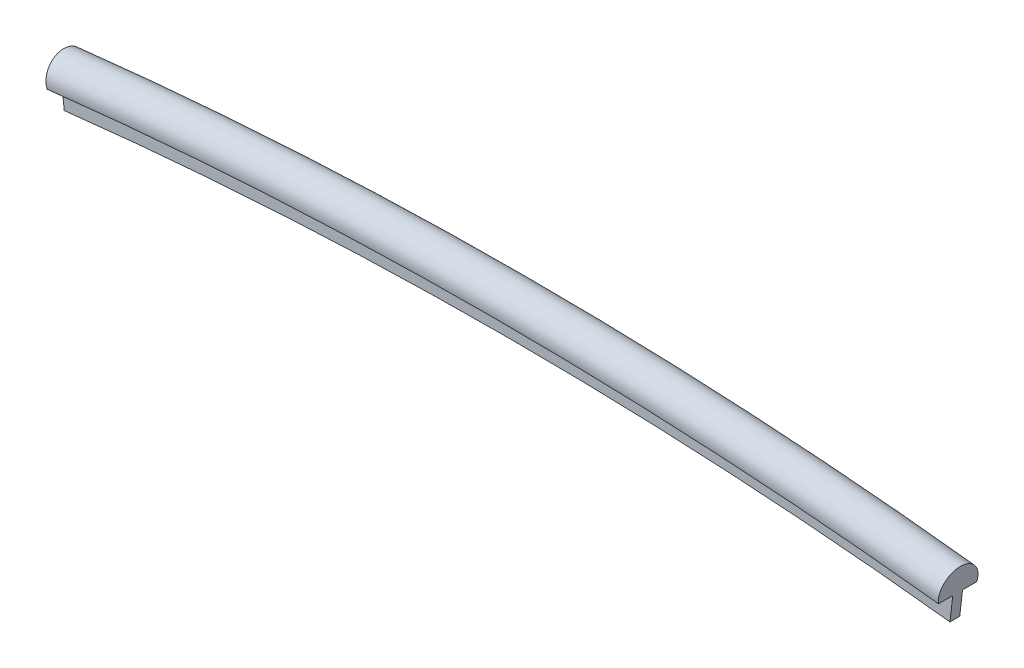
ISO-10303-21;
HEADER;
FILE_DESCRIPTION(('STEP AP214'),'2;1');
FILE_NAME('part.step','',(''),(''),'','','');
FILE_SCHEMA(('AUTOMOTIVE_DESIGN { 1 0 10303 214 1 1 1 1 }'));
ENDSEC;
DATA;
#1=APPLICATION_CONTEXT('core data for automotive mechanical design processes');
#2=APPLICATION_PROTOCOL_DEFINITION('international standard','automotive_design',2000,#1);
#3=PRODUCT_CONTEXT('',#1,'mechanical');
#4=PRODUCT('Part','Part','',(#3));
#5=PRODUCT_RELATED_PRODUCT_CATEGORY('part','',(#4));
#6=PRODUCT_DEFINITION_FORMATION('','',#4);
#7=PRODUCT_DEFINITION_CONTEXT('part definition',#1,'design');
#8=PRODUCT_DEFINITION('design','',#6,#7);
#9=PRODUCT_DEFINITION_SHAPE('','',#8);
#10=(LENGTH_UNIT() NAMED_UNIT(*) SI_UNIT(.MILLI.,.METRE.));
#11=(NAMED_UNIT(*) PLANE_ANGLE_UNIT() SI_UNIT($,.RADIAN.));
#12=(NAMED_UNIT(*) SI_UNIT($,.STERADIAN.) SOLID_ANGLE_UNIT());
#13=UNCERTAINTY_MEASURE_WITH_UNIT(LENGTH_MEASURE(1.E-05),#10,'distance_accuracy_value','');
#14=(GEOMETRIC_REPRESENTATION_CONTEXT(3) GLOBAL_UNCERTAINTY_ASSIGNED_CONTEXT((#13)) GLOBAL_UNIT_ASSIGNED_CONTEXT((#10,
#11,#12)) REPRESENTATION_CONTEXT('',''));
#15=CARTESIAN_POINT('',(0.,0.,0.));
#16=DIRECTION('',(0.,0.,1.));
#17=DIRECTION('',(1.,0.,0.));
#18=AXIS2_PLACEMENT_3D('',#15,#16,#17);
#19=CARTESIAN_POINT('',(0.,0.,70.5976415970385));
#20=DIRECTION('',(0.,0.,1.));
#21=DIRECTION('',(1.,0.,0.));
#22=AXIS2_PLACEMENT_3D('',#19,#20,#21);
#23=CYLINDRICAL_SURFACE('',#22,241.3);
#24=CARTESIAN_POINT('',(0.,0.,1.18));
#25=DIRECTION('',(0.,0.,1.));
#26=DIRECTION('',(1.,0.,0.));
#27=AXIS2_PLACEMENT_3D('',#24,#25,#26);
#28=CIRCLE('',#27,241.3);
#29=CARTESIAN_POINT('',(27.4256294724037,239.736365301642,1.18));
#30=VERTEX_POINT('',#29);
#31=CARTESIAN_POINT('',(-27.4256294724037,239.736365301642,1.18));
#32=VERTEX_POINT('',#31);
#33=EDGE_CURVE('E11',#30,#32,#28,.T.);
#34=ORIENTED_EDGE('',*,*,#33,.T.);
#35=DIRECTION('',(0.,0.,-1.));
#36=VECTOR('',#35,1.);
#37=CARTESIAN_POINT('',(-27.4256294724037,239.736365301642,1.18));
#38=LINE('',#37,#36);
#39=CARTESIAN_POINT('',(-27.4256294724037,239.736365301642,0.3));
#40=VERTEX_POINT('',#39);
#41=EDGE_CURVE('E103',#32,#40,#38,.T.);
#42=ORIENTED_EDGE('',*,*,#41,.T.);
#43=CARTESIAN_POINT('',(0.,0.,0.299999999999995));
#44=DIRECTION('',(0.,0.,1.));
#45=DIRECTION('',(1.,0.,0.));
#46=AXIS2_PLACEMENT_3D('',#43,#44,#45);
#47=CIRCLE('',#46,241.3);
#48=CARTESIAN_POINT('',(27.4256294724037,239.736365301642,0.3));
#49=VERTEX_POINT('',#48);
#50=EDGE_CURVE('E85',#49,#40,#47,.T.);
#51=ORIENTED_EDGE('',*,*,#50,.F.);
#52=DIRECTION('',(0.,0.,-1.));
#53=VECTOR('',#52,1.);
#54=CARTESIAN_POINT('',(27.4256294724037,239.736365301642,1.18));
#55=LINE('',#54,#53);
#56=EDGE_CURVE('E117',#30,#49,#55,.T.);
#57=ORIENTED_EDGE('',*,*,#56,.F.);
#58=EDGE_LOOP('',(#34,#42,#51,#57));
#59=FACE_BOUND('',#58,.T.);
#60=ADVANCED_FACE('F33',(#59),#23,.F.);
#61=CARTESIAN_POINT('',(0.,0.,0.));
#62=DIRECTION('',(0.,0.,1.));
#63=DIRECTION('',(1.,0.,0.));
#64=AXIS2_PLACEMENT_3D('',#61,#62,#63);
#65=TOROIDAL_SURFACE('',#64,241.586013989906,1.21416802890791);
#66=CARTESIAN_POINT('',(0.,0.,-1.18));
#67=DIRECTION('',(0.,0.,1.));
#68=DIRECTION('',(1.,0.,0.));
#69=AXIS2_PLACEMENT_3D('',#66,#67,#68);
#70=CIRCLE('',#69,241.3);
#71=CARTESIAN_POINT('',(27.4256294724037,239.736365301642,-1.18));
#72=VERTEX_POINT('',#71);
#73=CARTESIAN_POINT('',(-27.4256294724037,239.736365301642,-1.18));
#74=VERTEX_POINT('',#73);
#75=EDGE_CURVE('E41',#72,#74,#70,.T.);
#76=ORIENTED_EDGE('',*,*,#75,.T.);
#77=CARTESIAN_POINT('',(-27.4581371960303,240.020525908213,0.));
#78=DIRECTION('',(0.993519955663664,0.113657809665991,0.));
#79=DIRECTION('',(0.,0.,1.));
#80=AXIS2_PLACEMENT_3D('',#77,#78,#79);
#81=CIRCLE('',#80,1.21416802890791);
#82=EDGE_CURVE('E115',#74,#32,#81,.T.);
#83=ORIENTED_EDGE('',*,*,#82,.T.);
#84=ORIENTED_EDGE('',*,*,#33,.F.);
#85=CARTESIAN_POINT('',(27.4581371960303,240.020525908213,0.));
#86=DIRECTION('',(0.993519955663664,-0.113657809665991,0.));
#87=DIRECTION('',(0.,0.,1.));
#88=AXIS2_PLACEMENT_3D('',#85,#86,#87);
#89=CIRCLE('',#88,1.21416802890791);
#90=EDGE_CURVE('E97',#72,#30,#89,.T.);
#91=ORIENTED_EDGE('',*,*,#90,.F.);
#92=EDGE_LOOP('',(#76,#83,#84,#91));
#93=FACE_BOUND('',#92,.T.);
#94=ADVANCED_FACE('F35',(#93),#65,.T.);
#95=CARTESIAN_POINT('',(0.,0.,70.5976415970385));
#96=DIRECTION('',(0.,0.,1.));
#97=DIRECTION('',(1.,0.,0.));
#98=AXIS2_PLACEMENT_3D('',#95,#96,#97);
#99=CYLINDRICAL_SURFACE('',#98,241.3);
#100=CARTESIAN_POINT('',(0.,0.,-0.299999999999995));
#101=DIRECTION('',(0.,0.,1.));
#102=DIRECTION('',(1.,0.,0.));
#103=AXIS2_PLACEMENT_3D('',#100,#101,#102);
#104=CIRCLE('',#103,241.3);
#105=CARTESIAN_POINT('',(27.4256294724037,239.736365301642,-0.3));
#106=VERTEX_POINT('',#105);
#107=CARTESIAN_POINT('',(-27.4256294724037,239.736365301642,-0.3));
#108=VERTEX_POINT('',#107);
#109=EDGE_CURVE('E132',#106,#108,#104,.T.);
#110=ORIENTED_EDGE('',*,*,#109,.T.);
#111=DIRECTION('',(0.,0.,-1.));
#112=VECTOR('',#111,1.);
#113=CARTESIAN_POINT('',(-27.4256294724037,239.736365301642,-0.3));
#114=LINE('',#113,#112);
#115=EDGE_CURVE('E113',#108,#74,#114,.T.);
#116=ORIENTED_EDGE('',*,*,#115,.T.);
#117=ORIENTED_EDGE('',*,*,#75,.F.);
#118=DIRECTION('',(0.,0.,-1.));
#119=VECTOR('',#118,1.);
#120=CARTESIAN_POINT('',(27.4256294724037,239.736365301642,-0.3));
#121=LINE('',#120,#119);
#122=EDGE_CURVE('E125',#106,#72,#121,.T.);
#123=ORIENTED_EDGE('',*,*,#122,.F.);
#124=EDGE_LOOP('',(#110,#116,#117,#123));
#125=FACE_BOUND('',#124,.T.);
#126=ADVANCED_FACE('F134',(#125),#99,.F.);
#127=CARTESIAN_POINT('',(27.2551427579047,238.246085368147,-0.3));
#128=DIRECTION('',(0.,0.,1.));
#129=DIRECTION('',(1.,0.,0.));
#130=AXIS2_PLACEMENT_3D('',#127,#128,#129);
#131=PLANE('',#130);
#132=CARTESIAN_POINT('',(0.,0.,-0.299999999999995));
#133=DIRECTION('',(0.,0.,1.));
#134=DIRECTION('',(1.,0.,0.));
#135=AXIS2_PLACEMENT_3D('',#132,#133,#134);
#136=CIRCLE('',#135,239.8);
#137=CARTESIAN_POINT('',(27.2551427579047,238.246085368147,-0.3));
#138=VERTEX_POINT('',#137);
#139=CARTESIAN_POINT('',(-27.2551427579047,238.246085368147,-0.3));
#140=VERTEX_POINT('',#139);
#141=EDGE_CURVE('E129',#138,#140,#136,.T.);
#142=ORIENTED_EDGE('',*,*,#141,.T.);
#143=DIRECTION('',(-0.113657809665991,0.993519955663664,0.));
#144=VECTOR('',#143,1.);
#145=CARTESIAN_POINT('',(-27.2551427579047,238.246085368147,-0.3));
#146=LINE('',#145,#144);
#147=EDGE_CURVE('E110',#140,#108,#146,.T.);
#148=ORIENTED_EDGE('',*,*,#147,.T.);
#149=ORIENTED_EDGE('',*,*,#109,.F.);
#150=DIRECTION('',(0.113657809665991,0.993519955663664,0.));
#151=VECTOR('',#150,1.);
#152=CARTESIAN_POINT('',(27.2551427579047,238.246085368147,-0.3));
#153=LINE('',#152,#151);
#154=EDGE_CURVE('E122',#138,#106,#153,.T.);
#155=ORIENTED_EDGE('',*,*,#154,.F.);
#156=EDGE_LOOP('',(#142,#148,#149,#155));
#157=FACE_BOUND('',#156,.T.);
#158=ADVANCED_FACE('F136',(#157),#131,.F.);
#159=CARTESIAN_POINT('',(0.,0.,70.5976415970385));
#160=DIRECTION('',(0.,0.,1.));
#161=DIRECTION('',(1.,0.,0.));
#162=AXIS2_PLACEMENT_3D('',#159,#160,#161);
#163=CYLINDRICAL_SURFACE('',#162,239.8);
#164=CARTESIAN_POINT('',(0.,0.,0.299999999999995));
#165=DIRECTION('',(0.,0.,1.));
#166=DIRECTION('',(1.,0.,0.));
#167=AXIS2_PLACEMENT_3D('',#164,#165,#166);
#168=CIRCLE('',#167,239.8);
#169=CARTESIAN_POINT('',(27.2551427579047,238.246085368147,0.3));
#170=VERTEX_POINT('',#169);
#171=CARTESIAN_POINT('',(-27.2551427579047,238.246085368147,0.3));
#172=VERTEX_POINT('',#171);
#173=EDGE_CURVE('E96',#170,#172,#168,.T.);
#174=ORIENTED_EDGE('',*,*,#173,.T.);
#175=DIRECTION('',(0.,0.,-1.));
#176=VECTOR('',#175,1.);
#177=CARTESIAN_POINT('',(-27.2551427579047,238.246085368147,0.));
#178=LINE('',#177,#176);
#179=EDGE_CURVE('E105',#172,#140,#178,.T.);
#180=ORIENTED_EDGE('',*,*,#179,.T.);
#181=ORIENTED_EDGE('',*,*,#141,.F.);
#182=DIRECTION('',(0.,0.,-1.));
#183=VECTOR('',#182,1.);
#184=CARTESIAN_POINT('',(27.2551427579047,238.246085368147,0.));
#185=LINE('',#184,#183);
#186=EDGE_CURVE('E120',#170,#138,#185,.T.);
#187=ORIENTED_EDGE('',*,*,#186,.F.);
#188=EDGE_LOOP('',(#174,#180,#181,#187));
#189=FACE_BOUND('',#188,.T.);
#190=ADVANCED_FACE('F141',(#189),#163,.F.);
#191=CARTESIAN_POINT('',(27.2551427579047,238.246085368147,0.3));
#192=DIRECTION('',(0.,0.,-1.));
#193=DIRECTION('',(-1.,0.,0.));
#194=AXIS2_PLACEMENT_3D('',#191,#192,#193);
#195=PLANE('',#194);
#196=DIRECTION('',(-0.113657809665991,-0.993519955663664,0.));
#197=VECTOR('',#196,1.);
#198=CARTESIAN_POINT('',(27.2551427579047,238.246085368147,0.3));
#199=LINE('',#198,#197);
#200=EDGE_CURVE('E91',#49,#170,#199,.T.);
#201=ORIENTED_EDGE('',*,*,#200,.F.);
#202=ORIENTED_EDGE('',*,*,#50,.T.);
#203=DIRECTION('',(0.113657809665991,-0.993519955663664,0.));
#204=VECTOR('',#203,1.);
#205=CARTESIAN_POINT('',(-27.2551427579047,238.246085368147,0.3));
#206=LINE('',#205,#204);
#207=EDGE_CURVE('E88',#40,#172,#206,.T.);
#208=ORIENTED_EDGE('',*,*,#207,.T.);
#209=ORIENTED_EDGE('',*,*,#173,.F.);
#210=EDGE_LOOP('',(#201,#202,#208,#209));
#211=FACE_BOUND('',#210,.T.);
#212=ADVANCED_FACE('F87',(#211),#195,.F.);
#213=CARTESIAN_POINT('',(27.4581371960303,240.020525908213,0.));
#214=DIRECTION('',(-0.993519955663664,0.113657809665991,0.));
#215=DIRECTION('',(0.,0.,1.));
#216=AXIS2_PLACEMENT_3D('',#213,#214,#215);
#217=PLANE('',#216);
#218=ORIENTED_EDGE('',*,*,#56,.T.);
#219=ORIENTED_EDGE('',*,*,#200,.T.);
#220=ORIENTED_EDGE('',*,*,#186,.T.);
#221=ORIENTED_EDGE('',*,*,#154,.T.);
#222=ORIENTED_EDGE('',*,*,#122,.T.);
#223=ORIENTED_EDGE('',*,*,#90,.T.);
#224=EDGE_LOOP('',(#218,#219,#220,#221,#222,#223));
#225=FACE_BOUND('',#224,.T.);
#226=ADVANCED_FACE('F143',(#225),#217,.F.);
#227=CARTESIAN_POINT('',(-27.4581371960303,240.020525908213,0.));
#228=DIRECTION('',(-0.993519955663664,-0.113657809665991,0.));
#229=DIRECTION('',(0.,0.,1.));
#230=AXIS2_PLACEMENT_3D('',#227,#228,#229);
#231=PLANE('',#230);
#232=ORIENTED_EDGE('',*,*,#41,.F.);
#233=ORIENTED_EDGE('',*,*,#82,.F.);
#234=ORIENTED_EDGE('',*,*,#115,.F.);
#235=ORIENTED_EDGE('',*,*,#147,.F.);
#236=ORIENTED_EDGE('',*,*,#179,.F.);
#237=ORIENTED_EDGE('',*,*,#207,.F.);
#238=EDGE_LOOP('',(#232,#233,#234,#235,#236,#237));
#239=FACE_BOUND('',#238,.T.);
#240=ADVANCED_FACE('F101',(#239),#231,.T.);
#241=CLOSED_SHELL('',(#60,#94,#126,#158,#190,#212,#226,#240));
#242=MANIFOLD_SOLID_BREP('B2',#241);
#243=ADVANCED_BREP_SHAPE_REPRESENTATION('',(#18,#242),#14);
#244=SHAPE_DEFINITION_REPRESENTATION(#9,#243);
ENDSEC;
END-ISO-10303-21;
